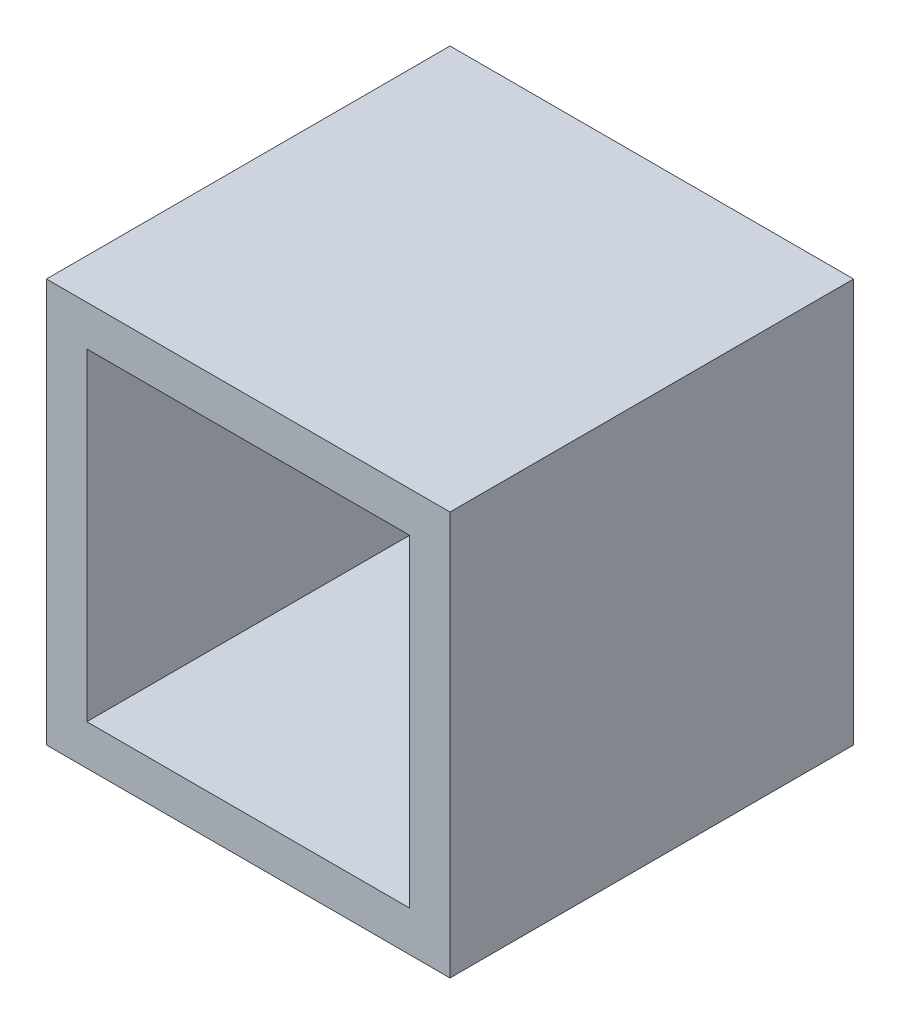
ISO-10303-21;
HEADER;
FILE_DESCRIPTION(('STEP AP214'),'2;1');
FILE_NAME('part.step','',(''),(''),'','','');
FILE_SCHEMA(('AUTOMOTIVE_DESIGN { 1 0 10303 214 1 1 1 1 }'));
ENDSEC;
DATA;
#1=APPLICATION_CONTEXT('core data for automotive mechanical design processes');
#2=APPLICATION_PROTOCOL_DEFINITION('international standard','automotive_design',2000,#1);
#3=PRODUCT_CONTEXT('',#1,'mechanical');
#4=PRODUCT('Part','Part','',(#3));
#5=PRODUCT_RELATED_PRODUCT_CATEGORY('part','',(#4));
#6=PRODUCT_DEFINITION_FORMATION('','',#4);
#7=PRODUCT_DEFINITION_CONTEXT('part definition',#1,'design');
#8=PRODUCT_DEFINITION('design','',#6,#7);
#9=PRODUCT_DEFINITION_SHAPE('','',#8);
#10=(LENGTH_UNIT() NAMED_UNIT(*) SI_UNIT(.MILLI.,.METRE.));
#11=(NAMED_UNIT(*) PLANE_ANGLE_UNIT() SI_UNIT($,.RADIAN.));
#12=(NAMED_UNIT(*) SI_UNIT($,.STERADIAN.) SOLID_ANGLE_UNIT());
#13=UNCERTAINTY_MEASURE_WITH_UNIT(LENGTH_MEASURE(1.E-05),#10,'distance_accuracy_value','');
#14=(GEOMETRIC_REPRESENTATION_CONTEXT(3) GLOBAL_UNCERTAINTY_ASSIGNED_CONTEXT((#13)) GLOBAL_UNIT_ASSIGNED_CONTEXT((#10,
#11,#12)) REPRESENTATION_CONTEXT('',''));
#15=CARTESIAN_POINT('',(0.,0.,0.));
#16=DIRECTION('',(0.,0.,1.));
#17=DIRECTION('',(1.,0.,0.));
#18=AXIS2_PLACEMENT_3D('',#15,#16,#17);
#19=CARTESIAN_POINT('',(0.,10.,10.));
#20=DIRECTION('',(0.,0.,-1.));
#21=DIRECTION('',(-1.,0.,0.));
#22=AXIS2_PLACEMENT_3D('',#19,#20,#21);
#23=PLANE('',#22);
#24=DIRECTION('',(0.,-1.,0.));
#25=VECTOR('',#24,1.);
#26=CARTESIAN_POINT('',(0.,0.,10.));
#27=LINE('',#26,#25);
#28=CARTESIAN_POINT('',(0.,10.,10.));
#29=VERTEX_POINT('',#28);
#30=CARTESIAN_POINT('',(0.,0.,10.));
#31=VERTEX_POINT('',#30);
#32=EDGE_CURVE('E143',#29,#31,#27,.T.);
#33=ORIENTED_EDGE('',*,*,#32,.T.);
#34=DIRECTION('',(1.,0.,0.));
#35=VECTOR('',#34,1.);
#36=CARTESIAN_POINT('',(0.,0.,10.));
#37=LINE('',#36,#35);
#38=CARTESIAN_POINT('',(10.,0.,10.));
#39=VERTEX_POINT('',#38);
#40=EDGE_CURVE('E87',#31,#39,#37,.T.);
#41=ORIENTED_EDGE('',*,*,#40,.T.);
#42=DIRECTION('',(0.,1.,0.));
#43=VECTOR('',#42,1.);
#44=CARTESIAN_POINT('',(10.,0.,10.));
#45=LINE('',#44,#43);
#46=CARTESIAN_POINT('',(10.,10.,10.));
#47=VERTEX_POINT('',#46);
#48=EDGE_CURVE('E146',#39,#47,#45,.T.);
#49=ORIENTED_EDGE('',*,*,#48,.T.);
#50=DIRECTION('',(-1.,0.,0.));
#51=VECTOR('',#50,1.);
#52=CARTESIAN_POINT('',(0.,10.,10.));
#53=LINE('',#52,#51);
#54=EDGE_CURVE('E59',#47,#29,#53,.T.);
#55=ORIENTED_EDGE('',*,*,#54,.T.);
#56=EDGE_LOOP('',(#33,#41,#49,#55));
#57=FACE_BOUND('',#56,.T.);
#58=DIRECTION('',(0.,-1.,0.));
#59=VECTOR('',#58,1.);
#60=CARTESIAN_POINT('',(1.,10.,10.));
#61=LINE('',#60,#59);
#62=CARTESIAN_POINT('',(1.,9.,10.));
#63=VERTEX_POINT('',#62);
#64=CARTESIAN_POINT('',(1.,1.,10.));
#65=VERTEX_POINT('',#64);
#66=EDGE_CURVE('E132',#63,#65,#61,.T.);
#67=ORIENTED_EDGE('',*,*,#66,.F.);
#68=DIRECTION('',(-1.,0.,0.));
#69=VECTOR('',#68,1.);
#70=CARTESIAN_POINT('',(0.,9.,10.));
#71=LINE('',#70,#69);
#72=CARTESIAN_POINT('',(9.,9.,10.));
#73=VERTEX_POINT('',#72);
#74=EDGE_CURVE('E141',#73,#63,#71,.T.);
#75=ORIENTED_EDGE('',*,*,#74,.F.);
#76=DIRECTION('',(0.,1.,0.));
#77=VECTOR('',#76,1.);
#78=CARTESIAN_POINT('',(9.,10.,10.));
#79=LINE('',#78,#77);
#80=CARTESIAN_POINT('',(9.,1.,10.));
#81=VERTEX_POINT('',#80);
#82=EDGE_CURVE('E139',#81,#73,#79,.T.);
#83=ORIENTED_EDGE('',*,*,#82,.F.);
#84=DIRECTION('',(1.,0.,0.));
#85=VECTOR('',#84,1.);
#86=CARTESIAN_POINT('',(0.,0.999999999999999,10.));
#87=LINE('',#86,#85);
#88=EDGE_CURVE('E124',#65,#81,#87,.T.);
#89=ORIENTED_EDGE('',*,*,#88,.F.);
#90=EDGE_LOOP('',(#67,#75,#83,#89));
#91=FACE_BOUND('',#90,.T.);
#92=ADVANCED_FACE('F35',(#57,#91),#23,.F.);
#93=CARTESIAN_POINT('',(0.,0.,10.));
#94=DIRECTION('',(1.,0.,0.));
#95=DIRECTION('',(0.,0.,-1.));
#96=AXIS2_PLACEMENT_3D('',#93,#94,#95);
#97=PLANE('',#96);
#98=DIRECTION('',(0.,-1.,0.));
#99=VECTOR('',#98,1.);
#100=CARTESIAN_POINT('',(0.,0.,0.));
#101=LINE('',#100,#99);
#102=CARTESIAN_POINT('',(0.,10.,0.));
#103=VERTEX_POINT('',#102);
#104=CARTESIAN_POINT('',(0.,0.,0.));
#105=VERTEX_POINT('',#104);
#106=EDGE_CURVE('E150',#103,#105,#101,.T.);
#107=ORIENTED_EDGE('',*,*,#106,.T.);
#108=DIRECTION('',(0.,0.,-1.));
#109=VECTOR('',#108,1.);
#110=CARTESIAN_POINT('',(0.,0.,10.));
#111=LINE('',#110,#109);
#112=EDGE_CURVE('E11',#31,#105,#111,.T.);
#113=ORIENTED_EDGE('',*,*,#112,.F.);
#114=ORIENTED_EDGE('',*,*,#32,.F.);
#115=DIRECTION('',(0.,0.,-1.));
#116=VECTOR('',#115,1.);
#117=CARTESIAN_POINT('',(0.,10.,10.));
#118=LINE('',#117,#116);
#119=EDGE_CURVE('E149',#29,#103,#118,.T.);
#120=ORIENTED_EDGE('',*,*,#119,.T.);
#121=EDGE_LOOP('',(#107,#113,#114,#120));
#122=FACE_BOUND('',#121,.T.);
#123=ADVANCED_FACE('F37',(#122),#97,.F.);
#124=CARTESIAN_POINT('',(0.,0.,10.));
#125=DIRECTION('',(0.,1.,0.));
#126=DIRECTION('',(0.,0.,1.));
#127=AXIS2_PLACEMENT_3D('',#124,#125,#126);
#128=PLANE('',#127);
#129=DIRECTION('',(1.,0.,0.));
#130=VECTOR('',#129,1.);
#131=CARTESIAN_POINT('',(0.,0.,0.));
#132=LINE('',#131,#130);
#133=CARTESIAN_POINT('',(10.,0.,0.));
#134=VERTEX_POINT('',#133);
#135=EDGE_CURVE('E153',#105,#134,#132,.T.);
#136=ORIENTED_EDGE('',*,*,#135,.T.);
#137=DIRECTION('',(0.,0.,-1.));
#138=VECTOR('',#137,1.);
#139=CARTESIAN_POINT('',(10.,0.,10.));
#140=LINE('',#139,#138);
#141=EDGE_CURVE('E43',#39,#134,#140,.T.);
#142=ORIENTED_EDGE('',*,*,#141,.F.);
#143=ORIENTED_EDGE('',*,*,#40,.F.);
#144=ORIENTED_EDGE('',*,*,#112,.T.);
#145=EDGE_LOOP('',(#136,#142,#143,#144));
#146=FACE_BOUND('',#145,.T.);
#147=ADVANCED_FACE('F181',(#146),#128,.F.);
#148=CARTESIAN_POINT('',(10.,0.,10.));
#149=DIRECTION('',(-1.,0.,0.));
#150=DIRECTION('',(0.,0.,1.));
#151=AXIS2_PLACEMENT_3D('',#148,#149,#150);
#152=PLANE('',#151);
#153=DIRECTION('',(0.,1.,0.));
#154=VECTOR('',#153,1.);
#155=CARTESIAN_POINT('',(10.,0.,0.));
#156=LINE('',#155,#154);
#157=CARTESIAN_POINT('',(10.,10.,0.));
#158=VERTEX_POINT('',#157);
#159=EDGE_CURVE('E155',#134,#158,#156,.T.);
#160=ORIENTED_EDGE('',*,*,#159,.T.);
#161=DIRECTION('',(0.,0.,-1.));
#162=VECTOR('',#161,1.);
#163=CARTESIAN_POINT('',(10.,10.,10.));
#164=LINE('',#163,#162);
#165=EDGE_CURVE('E159',#47,#158,#164,.T.);
#166=ORIENTED_EDGE('',*,*,#165,.F.);
#167=ORIENTED_EDGE('',*,*,#48,.F.);
#168=ORIENTED_EDGE('',*,*,#141,.T.);
#169=EDGE_LOOP('',(#160,#166,#167,#168));
#170=FACE_BOUND('',#169,.T.);
#171=ADVANCED_FACE('F164',(#170),#152,.F.);
#172=CARTESIAN_POINT('',(0.,10.,10.));
#173=DIRECTION('',(0.,-1.,0.));
#174=DIRECTION('',(0.,0.,-1.));
#175=AXIS2_PLACEMENT_3D('',#172,#173,#174);
#176=PLANE('',#175);
#177=DIRECTION('',(-1.,0.,0.));
#178=VECTOR('',#177,1.);
#179=CARTESIAN_POINT('',(0.,10.,0.));
#180=LINE('',#179,#178);
#181=EDGE_CURVE('E80',#158,#103,#180,.T.);
#182=ORIENTED_EDGE('',*,*,#181,.T.);
#183=ORIENTED_EDGE('',*,*,#119,.F.);
#184=ORIENTED_EDGE('',*,*,#54,.F.);
#185=ORIENTED_EDGE('',*,*,#165,.T.);
#186=EDGE_LOOP('',(#182,#183,#184,#185));
#187=FACE_BOUND('',#186,.T.);
#188=ADVANCED_FACE('F172',(#187),#176,.F.);
#189=CARTESIAN_POINT('',(0.,10.,0.));
#190=DIRECTION('',(0.,0.,-1.));
#191=DIRECTION('',(-1.,0.,0.));
#192=AXIS2_PLACEMENT_3D('',#189,#190,#191);
#193=PLANE('',#192);
#194=ORIENTED_EDGE('',*,*,#106,.F.);
#195=ORIENTED_EDGE('',*,*,#181,.F.);
#196=ORIENTED_EDGE('',*,*,#159,.F.);
#197=ORIENTED_EDGE('',*,*,#135,.F.);
#198=EDGE_LOOP('',(#194,#195,#196,#197));
#199=FACE_BOUND('',#198,.T.);
#200=ADVANCED_FACE('F168',(#199),#193,.T.);
#201=CARTESIAN_POINT('',(1.,0.,10.));
#202=DIRECTION('',(1.,0.,0.));
#203=DIRECTION('',(0.,0.,-1.));
#204=AXIS2_PLACEMENT_3D('',#201,#202,#203);
#205=PLANE('',#204);
#206=DIRECTION('',(0.,-1.,0.));
#207=VECTOR('',#206,1.);
#208=CARTESIAN_POINT('',(1.,10.,1.));
#209=LINE('',#208,#207);
#210=CARTESIAN_POINT('',(1.,9.,1.));
#211=VERTEX_POINT('',#210);
#212=CARTESIAN_POINT('',(1.,1.,1.));
#213=VERTEX_POINT('',#212);
#214=EDGE_CURVE('E115',#211,#213,#209,.T.);
#215=ORIENTED_EDGE('',*,*,#214,.F.);
#216=DIRECTION('',(0.,0.,-1.));
#217=VECTOR('',#216,1.);
#218=CARTESIAN_POINT('',(1.,9.,10.));
#219=LINE('',#218,#217);
#220=EDGE_CURVE('E135',#63,#211,#219,.T.);
#221=ORIENTED_EDGE('',*,*,#220,.F.);
#222=ORIENTED_EDGE('',*,*,#66,.T.);
#223=DIRECTION('',(0.,0.,-1.));
#224=VECTOR('',#223,1.);
#225=CARTESIAN_POINT('',(1.,1.,10.));
#226=LINE('',#225,#224);
#227=EDGE_CURVE('E127',#65,#213,#226,.T.);
#228=ORIENTED_EDGE('',*,*,#227,.T.);
#229=EDGE_LOOP('',(#215,#221,#222,#228));
#230=FACE_BOUND('',#229,.T.);
#231=ADVANCED_FACE('F179',(#230),#205,.T.);
#232=CARTESIAN_POINT('',(0.,1.,10.));
#233=DIRECTION('',(0.,1.,0.));
#234=DIRECTION('',(0.,0.,1.));
#235=AXIS2_PLACEMENT_3D('',#232,#233,#234);
#236=PLANE('',#235);
#237=DIRECTION('',(1.,0.,0.));
#238=VECTOR('',#237,1.);
#239=CARTESIAN_POINT('',(0.,0.999999999999999,1.));
#240=LINE('',#239,#238);
#241=CARTESIAN_POINT('',(9.,1.,1.));
#242=VERTEX_POINT('',#241);
#243=EDGE_CURVE('E109',#213,#242,#240,.T.);
#244=ORIENTED_EDGE('',*,*,#243,.F.);
#245=ORIENTED_EDGE('',*,*,#227,.F.);
#246=ORIENTED_EDGE('',*,*,#88,.T.);
#247=DIRECTION('',(0.,0.,-1.));
#248=VECTOR('',#247,1.);
#249=CARTESIAN_POINT('',(9.,1.,10.));
#250=LINE('',#249,#248);
#251=EDGE_CURVE('E121',#81,#242,#250,.T.);
#252=ORIENTED_EDGE('',*,*,#251,.T.);
#253=EDGE_LOOP('',(#244,#245,#246,#252));
#254=FACE_BOUND('',#253,.T.);
#255=ADVANCED_FACE('F122',(#254),#236,.T.);
#256=CARTESIAN_POINT('',(9.,0.,10.));
#257=DIRECTION('',(-1.,0.,0.));
#258=DIRECTION('',(0.,0.,1.));
#259=AXIS2_PLACEMENT_3D('',#256,#257,#258);
#260=PLANE('',#259);
#261=DIRECTION('',(0.,1.,0.));
#262=VECTOR('',#261,1.);
#263=CARTESIAN_POINT('',(9.,10.,1.));
#264=LINE('',#263,#262);
#265=CARTESIAN_POINT('',(9.,9.,1.));
#266=VERTEX_POINT('',#265);
#267=EDGE_CURVE('E113',#242,#266,#264,.T.);
#268=ORIENTED_EDGE('',*,*,#267,.F.);
#269=ORIENTED_EDGE('',*,*,#251,.F.);
#270=ORIENTED_EDGE('',*,*,#82,.T.);
#271=DIRECTION('',(0.,0.,-1.));
#272=VECTOR('',#271,1.);
#273=CARTESIAN_POINT('',(9.,9.,10.));
#274=LINE('',#273,#272);
#275=EDGE_CURVE('E50',#73,#266,#274,.T.);
#276=ORIENTED_EDGE('',*,*,#275,.T.);
#277=EDGE_LOOP('',(#268,#269,#270,#276));
#278=FACE_BOUND('',#277,.T.);
#279=ADVANCED_FACE('F129',(#278),#260,.T.);
#280=CARTESIAN_POINT('',(0.,9.,10.));
#281=DIRECTION('',(0.,-1.,0.));
#282=DIRECTION('',(0.,0.,-1.));
#283=AXIS2_PLACEMENT_3D('',#280,#281,#282);
#284=PLANE('',#283);
#285=DIRECTION('',(-1.,0.,0.));
#286=VECTOR('',#285,1.);
#287=CARTESIAN_POINT('',(0.,9.,1.));
#288=LINE('',#287,#286);
#289=EDGE_CURVE('E130',#266,#211,#288,.T.);
#290=ORIENTED_EDGE('',*,*,#289,.F.);
#291=ORIENTED_EDGE('',*,*,#275,.F.);
#292=ORIENTED_EDGE('',*,*,#74,.T.);
#293=ORIENTED_EDGE('',*,*,#220,.T.);
#294=EDGE_LOOP('',(#290,#291,#292,#293));
#295=FACE_BOUND('',#294,.T.);
#296=ADVANCED_FACE('F192',(#295),#284,.T.);
#297=CARTESIAN_POINT('',(0.,10.,1.));
#298=DIRECTION('',(0.,0.,-1.));
#299=DIRECTION('',(-1.,0.,0.));
#300=AXIS2_PLACEMENT_3D('',#297,#298,#299);
#301=PLANE('',#300);
#302=ORIENTED_EDGE('',*,*,#214,.T.);
#303=ORIENTED_EDGE('',*,*,#243,.T.);
#304=ORIENTED_EDGE('',*,*,#267,.T.);
#305=ORIENTED_EDGE('',*,*,#289,.T.);
#306=EDGE_LOOP('',(#302,#303,#304,#305));
#307=FACE_BOUND('',#306,.T.);
#308=ADVANCED_FACE('F111',(#307),#301,.F.);
#309=CLOSED_SHELL('',(#92,#123,#147,#171,#188,#200,#231,#255,#279,#296,#308));
#310=MANIFOLD_SOLID_BREP('B2',#309);
#311=ADVANCED_BREP_SHAPE_REPRESENTATION('',(#18,#310),#14);
#312=SHAPE_DEFINITION_REPRESENTATION(#9,#311);
ENDSEC;
END-ISO-10303-21;
